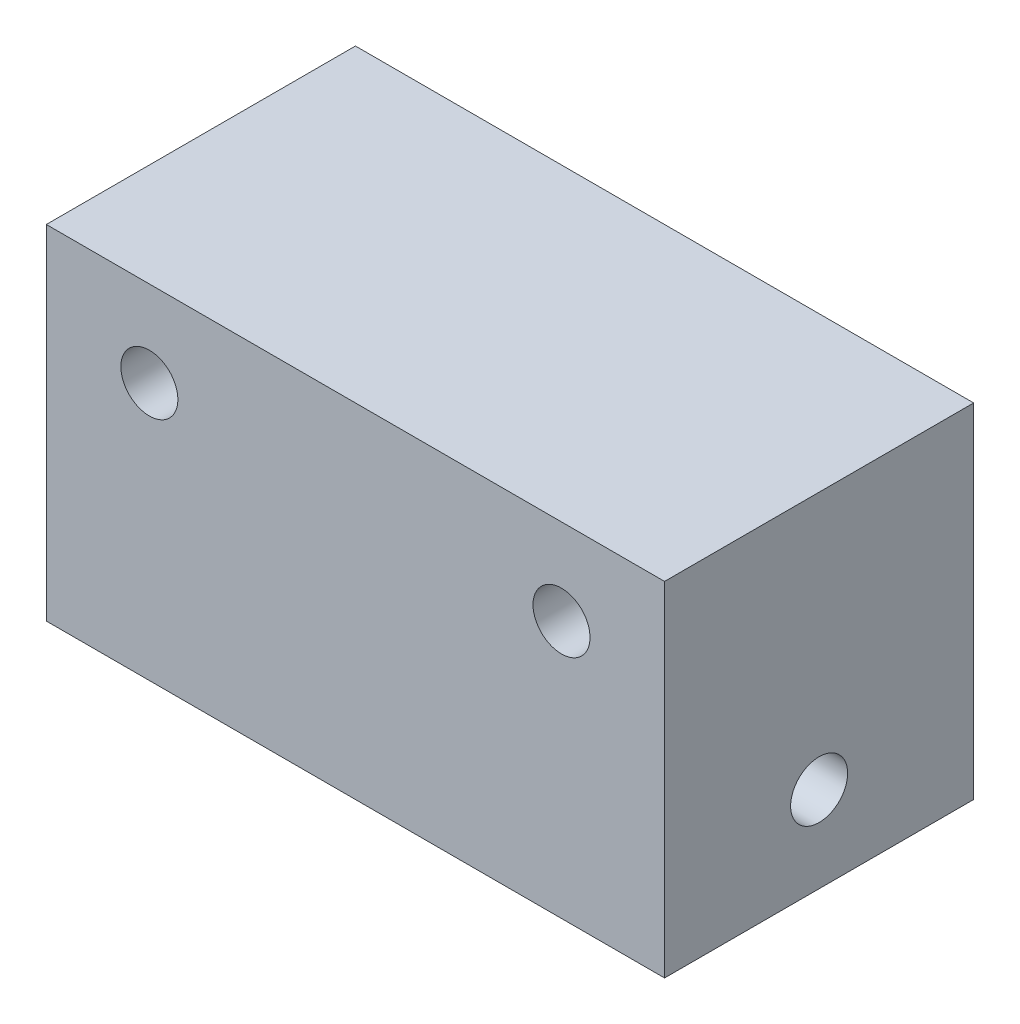
ISO-10303-21;
HEADER;
FILE_DESCRIPTION(('STEP AP214'),'2;1');
FILE_NAME('part.step','',(''),(''),'','','');
FILE_SCHEMA(('AUTOMOTIVE_DESIGN { 1 0 10303 214 1 1 1 1 }'));
ENDSEC;
DATA;
#1=APPLICATION_CONTEXT('core data for automotive mechanical design processes');
#2=APPLICATION_PROTOCOL_DEFINITION('international standard','automotive_design',2000,#1);
#3=PRODUCT_CONTEXT('',#1,'mechanical');
#4=PRODUCT('Part','Part','',(#3));
#5=PRODUCT_RELATED_PRODUCT_CATEGORY('part','',(#4));
#6=PRODUCT_DEFINITION_FORMATION('','',#4);
#7=PRODUCT_DEFINITION_CONTEXT('part definition',#1,'design');
#8=PRODUCT_DEFINITION('design','',#6,#7);
#9=PRODUCT_DEFINITION_SHAPE('','',#8);
#10=(LENGTH_UNIT() NAMED_UNIT(*) SI_UNIT(.MILLI.,.METRE.));
#11=(NAMED_UNIT(*) PLANE_ANGLE_UNIT() SI_UNIT($,.RADIAN.));
#12=(NAMED_UNIT(*) SI_UNIT($,.STERADIAN.) SOLID_ANGLE_UNIT());
#13=UNCERTAINTY_MEASURE_WITH_UNIT(LENGTH_MEASURE(1.E-05),#10,'distance_accuracy_value','');
#14=(GEOMETRIC_REPRESENTATION_CONTEXT(3) GLOBAL_UNCERTAINTY_ASSIGNED_CONTEXT((#13)) GLOBAL_UNIT_ASSIGNED_CONTEXT((#10,
#11,#12)) REPRESENTATION_CONTEXT('',''));
#15=CARTESIAN_POINT('',(0.,0.,0.));
#16=DIRECTION('',(0.,0.,1.));
#17=DIRECTION('',(1.,0.,0.));
#18=AXIS2_PLACEMENT_3D('',#15,#16,#17);
#19=CARTESIAN_POINT('',(44.9999999999999,50.,-22.5));
#20=DIRECTION('',(-1.,0.,0.));
#21=DIRECTION('',(0.,0.,1.));
#22=AXIS2_PLACEMENT_3D('',#19,#20,#21);
#23=PLANE('',#22);
#24=CARTESIAN_POINT('',(44.9999999999999,12.5,0.));
#25=DIRECTION('',(1.,0.,0.));
#26=DIRECTION('',(0.,0.,-1.));
#27=AXIS2_PLACEMENT_3D('',#24,#25,#26);
#28=CIRCLE('',#27,4.15);
#29=CARTESIAN_POINT('',(44.9999999999999,12.5,-4.15000000000001));
#30=VERTEX_POINT('',#29);
#31=EDGE_CURVE('E123',#30,#30,#28,.T.);
#32=ORIENTED_EDGE('',*,*,#31,.F.);
#33=EDGE_LOOP('',(#32));
#34=FACE_BOUND('',#33,.T.);
#35=DIRECTION('',(0.,0.,-1.));
#36=VECTOR('',#35,1.);
#37=CARTESIAN_POINT('',(44.9999999999999,0.,-22.5));
#38=LINE('',#37,#36);
#39=CARTESIAN_POINT('',(44.9999999999999,0.,22.5));
#40=VERTEX_POINT('',#39);
#41=CARTESIAN_POINT('',(44.9999999999999,0.,-22.5));
#42=VERTEX_POINT('',#41);
#43=EDGE_CURVE('E97',#40,#42,#38,.T.);
#44=ORIENTED_EDGE('',*,*,#43,.T.);
#45=DIRECTION('',(0.,-1.,0.));
#46=VECTOR('',#45,1.);
#47=CARTESIAN_POINT('',(44.9999999999999,50.,-22.5));
#48=LINE('',#47,#46);
#49=CARTESIAN_POINT('',(44.9999999999999,50.,-22.5));
#50=VERTEX_POINT('',#49);
#51=EDGE_CURVE('E11',#50,#42,#48,.T.);
#52=ORIENTED_EDGE('',*,*,#51,.F.);
#53=DIRECTION('',(0.,0.,-1.));
#54=VECTOR('',#53,1.);
#55=CARTESIAN_POINT('',(44.9999999999999,50.,-22.5));
#56=LINE('',#55,#54);
#57=CARTESIAN_POINT('',(44.9999999999999,50.,22.5));
#58=VERTEX_POINT('',#57);
#59=EDGE_CURVE('E85',#58,#50,#56,.T.);
#60=ORIENTED_EDGE('',*,*,#59,.F.);
#61=DIRECTION('',(0.,-1.,0.));
#62=VECTOR('',#61,1.);
#63=CARTESIAN_POINT('',(44.9999999999999,50.,22.5));
#64=LINE('',#63,#62);
#65=EDGE_CURVE('E93',#58,#40,#64,.T.);
#66=ORIENTED_EDGE('',*,*,#65,.T.);
#67=EDGE_LOOP('',(#44,#52,#60,#66));
#68=FACE_BOUND('',#67,.T.);
#69=ADVANCED_FACE('F34',(#34,#68),#23,.F.);
#70=CARTESIAN_POINT('',(-45.0000000000001,50.,-22.5));
#71=DIRECTION('',(0.,0.,1.));
#72=DIRECTION('',(1.,0.,0.));
#73=AXIS2_PLACEMENT_3D('',#70,#71,#72);
#74=PLANE('',#73);
#75=DIRECTION('',(-1.,0.,0.));
#76=VECTOR('',#75,1.);
#77=CARTESIAN_POINT('',(-45.0000000000001,0.,-22.5));
#78=LINE('',#77,#76);
#79=CARTESIAN_POINT('',(-45.0000000000001,0.,-22.5));
#80=VERTEX_POINT('',#79);
#81=EDGE_CURVE('E89',#42,#80,#78,.T.);
#82=ORIENTED_EDGE('',*,*,#81,.T.);
#83=DIRECTION('',(0.,-1.,0.));
#84=VECTOR('',#83,1.);
#85=CARTESIAN_POINT('',(-45.0000000000001,50.,-22.5));
#86=LINE('',#85,#84);
#87=CARTESIAN_POINT('',(-45.0000000000001,50.,-22.5));
#88=VERTEX_POINT('',#87);
#89=EDGE_CURVE('E42',#88,#80,#86,.T.);
#90=ORIENTED_EDGE('',*,*,#89,.F.);
#91=DIRECTION('',(-1.,0.,0.));
#92=VECTOR('',#91,1.);
#93=CARTESIAN_POINT('',(-45.0000000000001,50.,-22.5));
#94=LINE('',#93,#92);
#95=EDGE_CURVE('E80',#50,#88,#94,.T.);
#96=ORIENTED_EDGE('',*,*,#95,.F.);
#97=ORIENTED_EDGE('',*,*,#51,.T.);
#98=EDGE_LOOP('',(#82,#90,#96,#97));
#99=FACE_BOUND('',#98,.T.);
#100=ADVANCED_FACE('F88',(#99),#74,.F.);
#101=CARTESIAN_POINT('',(-45.0000000000001,50.,-22.5));
#102=DIRECTION('',(1.,0.,0.));
#103=DIRECTION('',(0.,0.,-1.));
#104=AXIS2_PLACEMENT_3D('',#101,#102,#103);
#105=PLANE('',#104);
#106=CARTESIAN_POINT('',(-45.0000000000001,12.5,0.));
#107=DIRECTION('',(1.,0.,0.));
#108=DIRECTION('',(0.,0.,-1.));
#109=AXIS2_PLACEMENT_3D('',#106,#107,#108);
#110=CIRCLE('',#109,4.15);
#111=CARTESIAN_POINT('',(-45.0000000000001,12.5,-4.14999999999999));
#112=VERTEX_POINT('',#111);
#113=EDGE_CURVE('E115',#112,#112,#110,.T.);
#114=ORIENTED_EDGE('',*,*,#113,.T.);
#115=EDGE_LOOP('',(#114));
#116=FACE_BOUND('',#115,.T.);
#117=DIRECTION('',(0.,0.,1.));
#118=VECTOR('',#117,1.);
#119=CARTESIAN_POINT('',(-45.0000000000001,0.,-22.5));
#120=LINE('',#119,#118);
#121=CARTESIAN_POINT('',(-45.0000000000001,0.,22.5));
#122=VERTEX_POINT('',#121);
#123=EDGE_CURVE('E67',#80,#122,#120,.T.);
#124=ORIENTED_EDGE('',*,*,#123,.T.);
#125=DIRECTION('',(0.,-1.,0.));
#126=VECTOR('',#125,1.);
#127=CARTESIAN_POINT('',(-45.0000000000001,50.,22.5));
#128=LINE('',#127,#126);
#129=CARTESIAN_POINT('',(-45.0000000000001,50.,22.5));
#130=VERTEX_POINT('',#129);
#131=EDGE_CURVE('E90',#130,#122,#128,.T.);
#132=ORIENTED_EDGE('',*,*,#131,.F.);
#133=DIRECTION('',(0.,0.,1.));
#134=VECTOR('',#133,1.);
#135=CARTESIAN_POINT('',(-45.0000000000001,50.,-22.5));
#136=LINE('',#135,#134);
#137=EDGE_CURVE('E83',#88,#130,#136,.T.);
#138=ORIENTED_EDGE('',*,*,#137,.F.);
#139=ORIENTED_EDGE('',*,*,#89,.T.);
#140=EDGE_LOOP('',(#124,#132,#138,#139));
#141=FACE_BOUND('',#140,.T.);
#142=ADVANCED_FACE('F91',(#116,#141),#105,.F.);
#143=CARTESIAN_POINT('',(-45.0000000000001,50.,22.5));
#144=DIRECTION('',(0.,0.,-1.));
#145=DIRECTION('',(-1.,0.,0.));
#146=AXIS2_PLACEMENT_3D('',#143,#144,#145);
#147=PLANE('',#146);
#148=CARTESIAN_POINT('',(-30.,37.5,22.5));
#149=DIRECTION('',(0.,0.,1.));
#150=DIRECTION('',(1.,0.,0.));
#151=AXIS2_PLACEMENT_3D('',#148,#149,#150);
#152=CIRCLE('',#151,4.15);
#153=CARTESIAN_POINT('',(-25.85,37.5,22.5));
#154=VERTEX_POINT('',#153);
#155=EDGE_CURVE('E118',#154,#154,#152,.T.);
#156=ORIENTED_EDGE('',*,*,#155,.F.);
#157=EDGE_LOOP('',(#156));
#158=FACE_BOUND('',#157,.T.);
#159=CARTESIAN_POINT('',(30.,37.5,22.5));
#160=DIRECTION('',(0.,0.,1.));
#161=DIRECTION('',(-1.,0.,0.));
#162=AXIS2_PLACEMENT_3D('',#159,#160,#161);
#163=CIRCLE('',#162,4.15);
#164=CARTESIAN_POINT('',(25.85,37.5,22.5));
#165=VERTEX_POINT('',#164);
#166=EDGE_CURVE('E111',#165,#165,#163,.T.);
#167=ORIENTED_EDGE('',*,*,#166,.F.);
#168=EDGE_LOOP('',(#167));
#169=FACE_BOUND('',#168,.T.);
#170=DIRECTION('',(1.,0.,0.));
#171=VECTOR('',#170,1.);
#172=CARTESIAN_POINT('',(-45.0000000000001,0.,22.5));
#173=LINE('',#172,#171);
#174=EDGE_CURVE('E73',#122,#40,#173,.T.);
#175=ORIENTED_EDGE('',*,*,#174,.T.);
#176=ORIENTED_EDGE('',*,*,#65,.F.);
#177=DIRECTION('',(1.,0.,0.));
#178=VECTOR('',#177,1.);
#179=CARTESIAN_POINT('',(-45.0000000000001,50.,22.5));
#180=LINE('',#179,#178);
#181=EDGE_CURVE('E50',#130,#58,#180,.T.);
#182=ORIENTED_EDGE('',*,*,#181,.F.);
#183=ORIENTED_EDGE('',*,*,#131,.T.);
#184=EDGE_LOOP('',(#175,#176,#182,#183));
#185=FACE_BOUND('',#184,.T.);
#186=ADVANCED_FACE('F105',(#158,#169,#185),#147,.F.);
#187=CARTESIAN_POINT('',(0.,50.,0.));
#188=DIRECTION('',(0.,1.,0.));
#189=DIRECTION('',(0.,0.,1.));
#190=AXIS2_PLACEMENT_3D('',#187,#188,#189);
#191=PLANE('',#190);
#192=ORIENTED_EDGE('',*,*,#59,.T.);
#193=ORIENTED_EDGE('',*,*,#95,.T.);
#194=ORIENTED_EDGE('',*,*,#137,.T.);
#195=ORIENTED_EDGE('',*,*,#181,.T.);
#196=EDGE_LOOP('',(#192,#193,#194,#195));
#197=FACE_BOUND('',#196,.T.);
#198=ADVANCED_FACE('F81',(#197),#191,.T.);
#199=CARTESIAN_POINT('',(0.,0.,0.));
#200=DIRECTION('',(0.,1.,0.));
#201=DIRECTION('',(0.,0.,1.));
#202=AXIS2_PLACEMENT_3D('',#199,#200,#201);
#203=PLANE('',#202);
#204=ORIENTED_EDGE('',*,*,#43,.F.);
#205=ORIENTED_EDGE('',*,*,#174,.F.);
#206=ORIENTED_EDGE('',*,*,#123,.F.);
#207=ORIENTED_EDGE('',*,*,#81,.F.);
#208=EDGE_LOOP('',(#204,#205,#206,#207));
#209=FACE_BOUND('',#208,.T.);
#210=ADVANCED_FACE('F108',(#209),#203,.F.);
#211=CARTESIAN_POINT('',(30.,37.5,-5.79666492389424));
#212=DIRECTION('',(0.,0.,1.));
#213=DIRECTION('',(1.,0.,0.));
#214=AXIS2_PLACEMENT_3D('',#211,#212,#213);
#215=CYLINDRICAL_SURFACE('',#214,4.15);
#216=CARTESIAN_POINT('',(30.,37.5,-5.79666492389424));
#217=DIRECTION('',(0.,0.,1.));
#218=DIRECTION('',(-1.,0.,0.));
#219=AXIS2_PLACEMENT_3D('',#216,#217,#218);
#220=CIRCLE('',#219,4.15);
#221=CARTESIAN_POINT('',(25.85,37.5,-5.79666492389424));
#222=VERTEX_POINT('',#221);
#223=EDGE_CURVE('E114',#222,#222,#220,.T.);
#224=ORIENTED_EDGE('',*,*,#223,.F.);
#225=EDGE_LOOP('',(#224));
#226=FACE_BOUND('',#225,.T.);
#227=ORIENTED_EDGE('',*,*,#166,.T.);
#228=EDGE_LOOP('',(#227));
#229=FACE_BOUND('',#228,.T.);
#230=ADVANCED_FACE('F151',(#226,#229),#215,.F.);
#231=CARTESIAN_POINT('',(30.,37.5,-5.79666492389424));
#232=DIRECTION('',(0.,0.,-1.));
#233=DIRECTION('',(-1.,0.,0.));
#234=AXIS2_PLACEMENT_3D('',#231,#232,#233);
#235=PLANE('',#234);
#236=ORIENTED_EDGE('',*,*,#223,.T.);
#237=EDGE_LOOP('',(#236));
#238=FACE_BOUND('',#237,.T.);
#239=ADVANCED_FACE('F156',(#238),#235,.F.);
#240=CARTESIAN_POINT('',(-30.,37.5,-5.79666492389424));
#241=DIRECTION('',(0.,0.,1.));
#242=DIRECTION('',(1.,0.,0.));
#243=AXIS2_PLACEMENT_3D('',#240,#241,#242);
#244=CYLINDRICAL_SURFACE('',#243,4.15);
#245=CARTESIAN_POINT('',(-30.,37.5,-5.79666492389424));
#246=DIRECTION('',(0.,0.,1.));
#247=DIRECTION('',(1.,0.,0.));
#248=AXIS2_PLACEMENT_3D('',#245,#246,#247);
#249=CIRCLE('',#248,4.15);
#250=CARTESIAN_POINT('',(-25.85,37.5,-5.79666492389424));
#251=VERTEX_POINT('',#250);
#252=EDGE_CURVE('E100',#251,#251,#249,.T.);
#253=ORIENTED_EDGE('',*,*,#252,.F.);
#254=EDGE_LOOP('',(#253));
#255=FACE_BOUND('',#254,.T.);
#256=ORIENTED_EDGE('',*,*,#155,.T.);
#257=EDGE_LOOP('',(#256));
#258=FACE_BOUND('',#257,.T.);
#259=ADVANCED_FACE('F160',(#255,#258),#244,.F.);
#260=CARTESIAN_POINT('',(-30.,37.5,-5.79666492389424));
#261=DIRECTION('',(0.,0.,1.));
#262=DIRECTION('',(1.,0.,0.));
#263=AXIS2_PLACEMENT_3D('',#260,#261,#262);
#264=PLANE('',#263);
#265=ORIENTED_EDGE('',*,*,#252,.T.);
#266=EDGE_LOOP('',(#265));
#267=FACE_BOUND('',#266,.T.);
#268=ADVANCED_FACE('F133',(#267),#264,.T.);
#269=CARTESIAN_POINT('',(-45.0000000000001,12.5,0.));
#270=DIRECTION('',(1.,0.,0.));
#271=DIRECTION('',(0.,0.,-1.));
#272=AXIS2_PLACEMENT_3D('',#269,#270,#271);
#273=CYLINDRICAL_SURFACE('',#272,4.15);
#274=CARTESIAN_POINT('',(-45.0000000000001,12.5,-4.14999999999999));
#275=CARTESIAN_POINT('',(-44.0625000000001,12.5,-4.14999999999999));
#276=CARTESIAN_POINT('',(-43.1250000000001,12.5,-4.14999999999999));
#277=CARTESIAN_POINT('',(-41.2500000000001,12.5,-4.14999999999999));
#278=CARTESIAN_POINT('',(-40.3125000000001,12.5,-4.14999999999999));
#279=CARTESIAN_POINT('',(-38.4375000000001,12.5,-4.14999999999999));
#280=CARTESIAN_POINT('',(-37.5000000000001,12.5,-4.14999999999999));
#281=CARTESIAN_POINT('',(-35.6250000000001,12.5,-4.14999999999999));
#282=CARTESIAN_POINT('',(-34.6875000000001,12.5,-4.14999999999999));
#283=CARTESIAN_POINT('',(-32.8125000000001,12.5,-4.14999999999999));
#284=CARTESIAN_POINT('',(-31.8750000000001,12.5,-4.14999999999999));
#285=CARTESIAN_POINT('',(-30.0000000000001,12.5,-4.14999999999999));
#286=CARTESIAN_POINT('',(-29.0625000000001,12.5,-4.14999999999999));
#287=CARTESIAN_POINT('',(-27.1875000000001,12.5,-4.14999999999999));
#288=CARTESIAN_POINT('',(-26.2500000000001,12.5,-4.14999999999999));
#289=CARTESIAN_POINT('',(-24.3750000000001,12.5,-4.14999999999999));
#290=CARTESIAN_POINT('',(-23.4375000000001,12.5,-4.14999999999999));
#291=CARTESIAN_POINT('',(-21.5625000000001,12.5,-4.14999999999999));
#292=CARTESIAN_POINT('',(-20.6250000000001,12.5,-4.14999999999999));
#293=CARTESIAN_POINT('',(-18.7500000000001,12.5,-4.14999999999999));
#294=CARTESIAN_POINT('',(-17.8125000000001,12.5,-4.15));
#295=CARTESIAN_POINT('',(-15.9375000000001,12.5,-4.15));
#296=CARTESIAN_POINT('',(-15.0000000000001,12.5,-4.15));
#297=CARTESIAN_POINT('',(-13.1250000000001,12.5,-4.15));
#298=CARTESIAN_POINT('',(-12.1875000000001,12.5,-4.15));
#299=CARTESIAN_POINT('',(-10.3125000000001,12.5,-4.15));
#300=CARTESIAN_POINT('',(-9.3750000000001,12.5,-4.15));
#301=CARTESIAN_POINT('',(-7.5000000000001,12.5,-4.15));
#302=CARTESIAN_POINT('',(-6.5625000000001,12.5,-4.15));
#303=CARTESIAN_POINT('',(-4.6875000000001,12.5,-4.15));
#304=CARTESIAN_POINT('',(-3.7500000000001,12.5,-4.15));
#305=CARTESIAN_POINT('',(-1.8750000000001,12.5,-4.15));
#306=CARTESIAN_POINT('',(-0.937500000000098,12.5,-4.15));
#307=CARTESIAN_POINT('',(0.937499999999904,12.5,-4.15));
#308=CARTESIAN_POINT('',(1.8749999999999,12.5,-4.15));
#309=CARTESIAN_POINT('',(3.74999999999991,12.5,-4.15));
#310=CARTESIAN_POINT('',(4.68749999999991,12.5,-4.15));
#311=CARTESIAN_POINT('',(6.56249999999991,12.5,-4.15));
#312=CARTESIAN_POINT('',(7.4999999999999,12.5,-4.15));
#313=CARTESIAN_POINT('',(9.3749999999999,12.5,-4.15));
#314=CARTESIAN_POINT('',(10.3124999999999,12.5,-4.15));
#315=CARTESIAN_POINT('',(12.1874999999999,12.5,-4.15));
#316=CARTESIAN_POINT('',(13.1249999999999,12.5,-4.15));
#317=CARTESIAN_POINT('',(14.9999999999999,12.5,-4.15));
#318=CARTESIAN_POINT('',(15.9374999999999,12.5,-4.15000000000001));
#319=CARTESIAN_POINT('',(17.8124999999999,12.5,-4.15000000000001));
#320=CARTESIAN_POINT('',(18.7499999999999,12.5,-4.15000000000001));
#321=CARTESIAN_POINT('',(20.6249999999999,12.5,-4.15000000000001));
#322=CARTESIAN_POINT('',(21.5624999999999,12.5,-4.15000000000001));
#323=CARTESIAN_POINT('',(23.4374999999999,12.5,-4.15000000000001));
#324=CARTESIAN_POINT('',(24.3749999999999,12.5,-4.15000000000001));
#325=CARTESIAN_POINT('',(26.2499999999999,12.5,-4.15000000000001));
#326=CARTESIAN_POINT('',(27.1874999999999,12.5,-4.15000000000001));
#327=CARTESIAN_POINT('',(29.0624999999999,12.5,-4.15000000000001));
#328=CARTESIAN_POINT('',(29.9999999999999,12.5,-4.15000000000001));
#329=CARTESIAN_POINT('',(31.8749999999999,12.5,-4.15000000000001));
#330=CARTESIAN_POINT('',(32.8124999999999,12.5,-4.15000000000001));
#331=CARTESIAN_POINT('',(34.6874999999999,12.5,-4.15000000000001));
#332=CARTESIAN_POINT('',(35.6249999999999,12.5,-4.15000000000001));
#333=CARTESIAN_POINT('',(37.4999999999999,12.5,-4.15000000000001));
#334=CARTESIAN_POINT('',(38.4374999999999,12.5,-4.15000000000001));
#335=CARTESIAN_POINT('',(40.3124999999999,12.5,-4.15000000000001));
#336=CARTESIAN_POINT('',(41.2499999999999,12.5,-4.15000000000001));
#337=CARTESIAN_POINT('',(43.1249999999999,12.5,-4.15000000000001));
#338=CARTESIAN_POINT('',(44.0624999999999,12.5,-4.15000000000001));
#339=CARTESIAN_POINT('',(44.9999999999999,12.5,-4.15000000000001));
#340=B_SPLINE_CURVE_WITH_KNOTS('',3,(#274,#275,#276,#277,#278,#279,#280,#281,#282,#283,#284,
#285,#286,#287,#288,#289,#290,#291,#292,#293,#294,#295,#296,#297,#298,#299,#300,#301,#302,#303,
#304,#305,#306,#307,#308,#309,#310,#311,#312,#313,#314,#315,#316,#317,#318,#319,#320,#321,#322,
#323,#324,#325,#326,#327,#328,#329,#330,#331,#332,#333,#334,#335,#336,#337,#338,#339),
.UNSPECIFIED.,.F.,.F.,(4,2,2,2,2,2,2,2,2,2,2,2,2,2,2,2,2,2,2,2,2,2,2,2,2,2,2,2,2,2,2,2,4),(0.,
2.8125,5.625,8.43749999999999,11.25,14.0625,16.875,19.6875,22.5,25.3125,28.125,30.9375,33.75,
36.5625,39.375,42.1875,45.,47.8125,50.625,53.4375,56.25,59.0625,61.875,64.6875,67.5,70.3125,
73.125,75.9375,78.75,81.5625,84.375,87.1875,90.),.UNSPECIFIED.);
#341=EDGE_CURVE('BSEAM130',#112,#30,#340,.T.);
#342=ORIENTED_EDGE('',*,*,#113,.F.);
#343=ORIENTED_EDGE('',*,*,#31,.T.);
#344=ORIENTED_EDGE('',*,*,#341,.T.);
#345=ORIENTED_EDGE('',*,*,#341,.F.);
#346=EDGE_LOOP('',(#342,#344,#343,#345));
#347=FACE_BOUND('',#346,.T.);
#348=ADVANCED_FACE('F130',(#347),#273,.F.);
#349=CLOSED_SHELL('',(#69,#100,#142,#186,#198,#210,#230,#239,#259,#268,#348));
#350=MANIFOLD_SOLID_BREP('B2',#349);
#351=ADVANCED_BREP_SHAPE_REPRESENTATION('',(#18,#350),#14);
#352=SHAPE_DEFINITION_REPRESENTATION(#9,#351);
ENDSEC;
END-ISO-10303-21;
